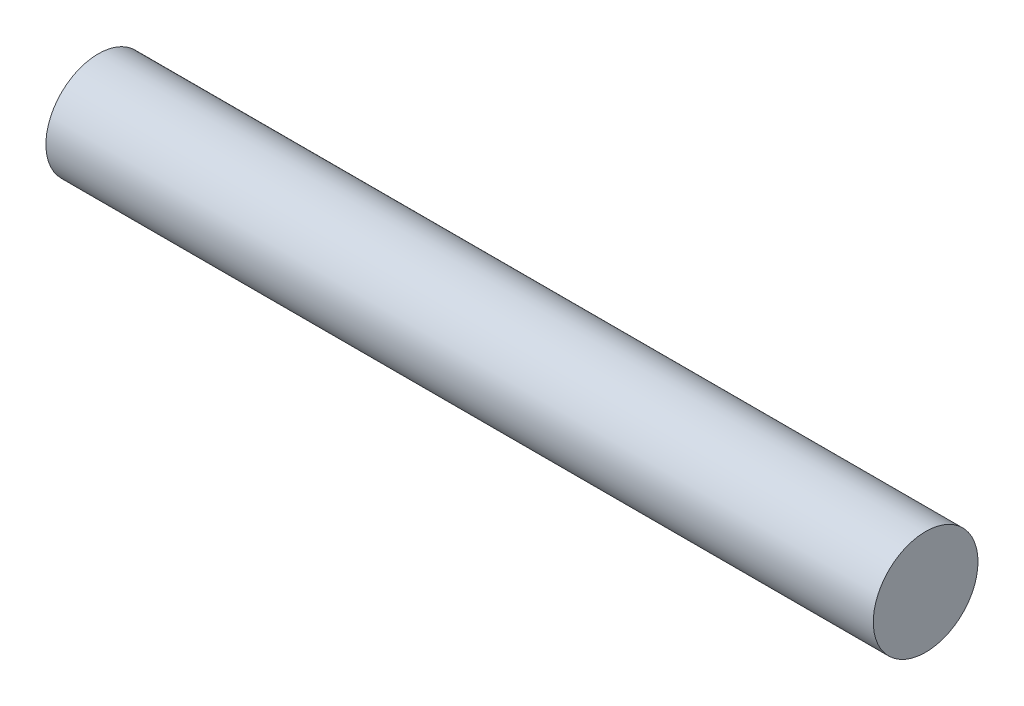
ISO-10303-21;
HEADER;
FILE_DESCRIPTION(('STEP AP214'),'2;1');
FILE_NAME('part.step','',(''),(''),'','','');
FILE_SCHEMA(('AUTOMOTIVE_DESIGN { 1 0 10303 214 1 1 1 1 }'));
ENDSEC;
DATA;
#1=APPLICATION_CONTEXT('core data for automotive mechanical design processes');
#2=APPLICATION_PROTOCOL_DEFINITION('international standard','automotive_design',2000,#1);
#3=PRODUCT_CONTEXT('',#1,'mechanical');
#4=PRODUCT('Part','Part','',(#3));
#5=PRODUCT_RELATED_PRODUCT_CATEGORY('part','',(#4));
#6=PRODUCT_DEFINITION_FORMATION('','',#4);
#7=PRODUCT_DEFINITION_CONTEXT('part definition',#1,'design');
#8=PRODUCT_DEFINITION('design','',#6,#7);
#9=PRODUCT_DEFINITION_SHAPE('','',#8);
#10=(LENGTH_UNIT() NAMED_UNIT(*) SI_UNIT(.MILLI.,.METRE.));
#11=(NAMED_UNIT(*) PLANE_ANGLE_UNIT() SI_UNIT($,.RADIAN.));
#12=(NAMED_UNIT(*) SI_UNIT($,.STERADIAN.) SOLID_ANGLE_UNIT());
#13=UNCERTAINTY_MEASURE_WITH_UNIT(LENGTH_MEASURE(1.E-05),#10,'distance_accuracy_value','');
#14=(GEOMETRIC_REPRESENTATION_CONTEXT(3) GLOBAL_UNCERTAINTY_ASSIGNED_CONTEXT((#13)) GLOBAL_UNIT_ASSIGNED_CONTEXT((#10,
#11,#12)) REPRESENTATION_CONTEXT('',''));
#15=CARTESIAN_POINT('',(0.,0.,0.));
#16=DIRECTION('',(0.,0.,1.));
#17=DIRECTION('',(1.,0.,0.));
#18=AXIS2_PLACEMENT_3D('',#15,#16,#17);
#19=CARTESIAN_POINT('',(160.,0.,0.));
#20=DIRECTION('',(-1.,0.,0.));
#21=DIRECTION('',(0.,0.,1.));
#22=AXIS2_PLACEMENT_3D('',#19,#20,#21);
#23=CYLINDRICAL_SURFACE('',#22,10.125);
#24=CARTESIAN_POINT('',(160.,0.,0.));
#25=DIRECTION('',(1.,0.,0.));
#26=DIRECTION('',(0.,0.,-1.));
#27=AXIS2_PLACEMENT_3D('',#24,#25,#26);
#28=CIRCLE('',#27,10.125);
#29=CARTESIAN_POINT('',(160.,0.,-10.125));
#30=VERTEX_POINT('',#29);
#31=EDGE_CURVE('E10',#30,#30,#28,.T.);
#32=ORIENTED_EDGE('',*,*,#31,.F.);
#33=EDGE_LOOP('',(#32));
#34=FACE_BOUND('',#33,.T.);
#35=CARTESIAN_POINT('',(0.,0.,0.));
#36=DIRECTION('',(1.,0.,0.));
#37=DIRECTION('',(0.,0.,-1.));
#38=AXIS2_PLACEMENT_3D('',#35,#36,#37);
#39=CIRCLE('',#38,10.125);
#40=CARTESIAN_POINT('',(0.,0.,-10.125));
#41=VERTEX_POINT('',#40);
#42=EDGE_CURVE('E34',#41,#41,#39,.T.);
#43=ORIENTED_EDGE('',*,*,#42,.T.);
#44=EDGE_LOOP('',(#43));
#45=FACE_BOUND('',#44,.T.);
#46=ADVANCED_FACE('F31',(#34,#45),#23,.T.);
#47=CARTESIAN_POINT('',(160.,0.,0.));
#48=DIRECTION('',(1.,0.,0.));
#49=DIRECTION('',(0.,0.,-1.));
#50=AXIS2_PLACEMENT_3D('',#47,#48,#49);
#51=PLANE('',#50);
#52=ORIENTED_EDGE('',*,*,#31,.T.);
#53=EDGE_LOOP('',(#52));
#54=FACE_BOUND('',#53,.T.);
#55=ADVANCED_FACE('F46',(#54),#51,.T.);
#56=CARTESIAN_POINT('',(0.,0.,0.));
#57=DIRECTION('',(1.,0.,0.));
#58=DIRECTION('',(0.,0.,-1.));
#59=AXIS2_PLACEMENT_3D('',#56,#57,#58);
#60=PLANE('',#59);
#61=ORIENTED_EDGE('',*,*,#42,.F.);
#62=EDGE_LOOP('',(#61));
#63=FACE_BOUND('',#62,.T.);
#64=ADVANCED_FACE('F44',(#63),#60,.F.);
#65=CLOSED_SHELL('',(#46,#55,#64));
#66=MANIFOLD_SOLID_BREP('B2',#65);
#67=ADVANCED_BREP_SHAPE_REPRESENTATION('',(#18,#66),#14);
#68=SHAPE_DEFINITION_REPRESENTATION(#9,#67);
ENDSEC;
END-ISO-10303-21;
